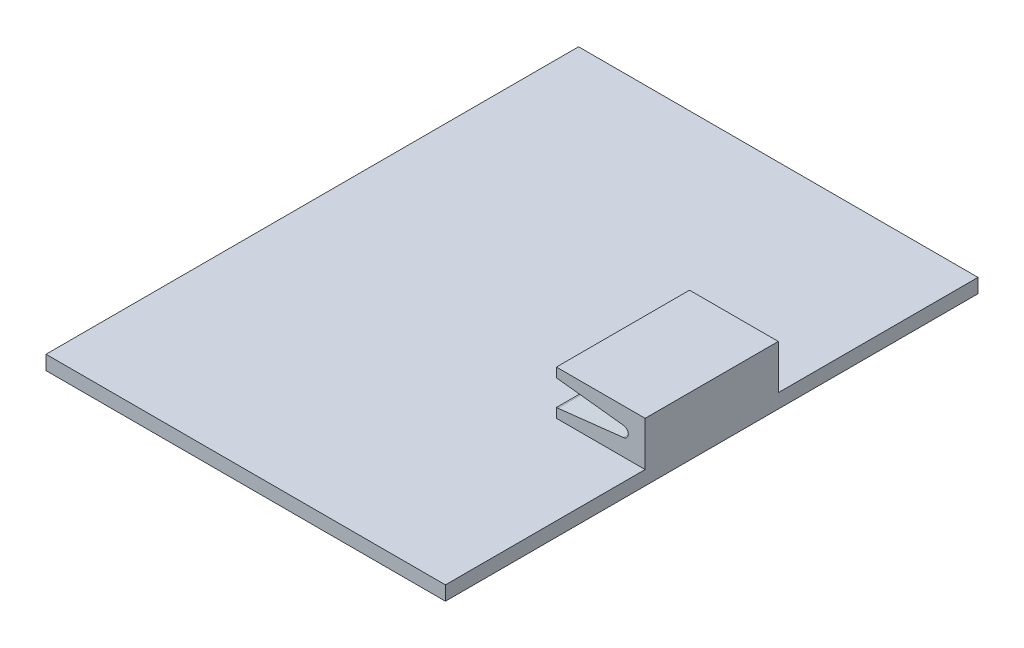
ISO-10303-21;
HEADER;
FILE_DESCRIPTION(('STEP AP214'),'2;1');
FILE_NAME('part.step','',(''),(''),'','','');
FILE_SCHEMA(('AUTOMOTIVE_DESIGN { 1 0 10303 214 1 1 1 1 }'));
ENDSEC;
DATA;
#1=APPLICATION_CONTEXT('core data for automotive mechanical design processes');
#2=APPLICATION_PROTOCOL_DEFINITION('international standard','automotive_design',2000,#1);
#3=PRODUCT_CONTEXT('',#1,'mechanical');
#4=PRODUCT('Part','Part','',(#3));
#5=PRODUCT_RELATED_PRODUCT_CATEGORY('part','',(#4));
#6=PRODUCT_DEFINITION_FORMATION('','',#4);
#7=PRODUCT_DEFINITION_CONTEXT('part definition',#1,'design');
#8=PRODUCT_DEFINITION('design','',#6,#7);
#9=PRODUCT_DEFINITION_SHAPE('','',#8);
#10=(LENGTH_UNIT() NAMED_UNIT(*) SI_UNIT(.MILLI.,.METRE.));
#11=(NAMED_UNIT(*) PLANE_ANGLE_UNIT() SI_UNIT($,.RADIAN.));
#12=(NAMED_UNIT(*) SI_UNIT($,.STERADIAN.) SOLID_ANGLE_UNIT());
#13=UNCERTAINTY_MEASURE_WITH_UNIT(LENGTH_MEASURE(1.E-05),#10,'distance_accuracy_value','');
#14=(GEOMETRIC_REPRESENTATION_CONTEXT(3) GLOBAL_UNCERTAINTY_ASSIGNED_CONTEXT((#13)) GLOBAL_UNIT_ASSIGNED_CONTEXT((#10,
#11,#12)) REPRESENTATION_CONTEXT('',''));
#15=CARTESIAN_POINT('',(0.,0.,0.));
#16=DIRECTION('',(0.,0.,1.));
#17=DIRECTION('',(1.,0.,0.));
#18=AXIS2_PLACEMENT_3D('',#15,#16,#17);
#19=CARTESIAN_POINT('',(125.,66.,-75.));
#20=DIRECTION('',(1.,0.,0.));
#21=DIRECTION('',(0.,0.,-1.));
#22=AXIS2_PLACEMENT_3D('',#19,#20,#21);
#23=PLANE('',#22);
#24=DIRECTION('',(0.,-1.,0.));
#25=VECTOR('',#24,1.);
#26=CARTESIAN_POINT('',(125.,66.,75.));
#27=LINE('',#26,#25);
#28=CARTESIAN_POINT('',(125.,26.5706899099176,75.));
#29=VERTEX_POINT('',#28);
#30=CARTESIAN_POINT('',(125.,16.,75.));
#31=VERTEX_POINT('',#30);
#32=EDGE_CURVE('E64',#29,#31,#27,.T.);
#33=ORIENTED_EDGE('',*,*,#32,.F.);
#34=DIRECTION('',(0.,0.,-1.));
#35=VECTOR('',#34,1.);
#36=CARTESIAN_POINT('',(125.,26.5706899099176,300.));
#37=LINE('',#36,#35);
#38=CARTESIAN_POINT('',(125.,26.5706899099176,-75.));
#39=VERTEX_POINT('',#38);
#40=EDGE_CURVE('E166',#29,#39,#37,.T.);
#41=ORIENTED_EDGE('',*,*,#40,.T.);
#42=DIRECTION('',(0.,-1.,0.));
#43=VECTOR('',#42,1.);
#44=CARTESIAN_POINT('',(125.,66.,-75.));
#45=LINE('',#44,#43);
#46=CARTESIAN_POINT('',(125.,16.,-75.));
#47=VERTEX_POINT('',#46);
#48=EDGE_CURVE('E164',#39,#47,#45,.T.);
#49=ORIENTED_EDGE('',*,*,#48,.T.);
#50=DIRECTION('',(0.,0.,1.));
#51=VECTOR('',#50,1.);
#52=CARTESIAN_POINT('',(125.,16.,-75.));
#53=LINE('',#52,#51);
#54=EDGE_CURVE('E194',#47,#31,#53,.T.);
#55=ORIENTED_EDGE('',*,*,#54,.T.);
#56=EDGE_LOOP('',(#33,#41,#49,#55));
#57=FACE_BOUND('',#56,.T.);
#58=ADVANCED_FACE('F39',(#57),#23,.F.);
#59=CARTESIAN_POINT('',(-225.,16.,300.));
#60=DIRECTION('',(0.,0.,-1.));
#61=DIRECTION('',(-1.,0.,0.));
#62=AXIS2_PLACEMENT_3D('',#59,#60,#61);
#63=PLANE('',#62);
#64=DIRECTION('',(1.,0.,0.));
#65=VECTOR('',#64,1.);
#66=CARTESIAN_POINT('',(-225.,0.,300.));
#67=LINE('',#66,#65);
#68=CARTESIAN_POINT('',(-225.,0.,300.));
#69=VERTEX_POINT('',#68);
#70=CARTESIAN_POINT('',(225.,0.,300.));
#71=VERTEX_POINT('',#70);
#72=EDGE_CURVE('E220',#69,#71,#67,.T.);
#73=ORIENTED_EDGE('',*,*,#72,.T.);
#74=DIRECTION('',(0.,-1.,0.));
#75=VECTOR('',#74,1.);
#76=CARTESIAN_POINT('',(225.,16.,300.));
#77=LINE('',#76,#75);
#78=CARTESIAN_POINT('',(225.,16.,300.));
#79=VERTEX_POINT('',#78);
#80=EDGE_CURVE('E250',#79,#71,#77,.T.);
#81=ORIENTED_EDGE('',*,*,#80,.F.);
#82=DIRECTION('',(1.,0.,0.));
#83=VECTOR('',#82,1.);
#84=CARTESIAN_POINT('',(-225.,16.,300.));
#85=LINE('',#84,#83);
#86=CARTESIAN_POINT('',(-225.,16.,300.));
#87=VERTEX_POINT('',#86);
#88=EDGE_CURVE('E221',#87,#79,#85,.T.);
#89=ORIENTED_EDGE('',*,*,#88,.F.);
#90=DIRECTION('',(0.,-1.,0.));
#91=VECTOR('',#90,1.);
#92=CARTESIAN_POINT('',(-225.,16.,300.));
#93=LINE('',#92,#91);
#94=EDGE_CURVE('E234',#87,#69,#93,.T.);
#95=ORIENTED_EDGE('',*,*,#94,.T.);
#96=EDGE_LOOP('',(#73,#81,#89,#95));
#97=FACE_BOUND('',#96,.T.);
#98=ADVANCED_FACE('F41',(#97),#63,.F.);
#99=CARTESIAN_POINT('',(225.,16.,300.));
#100=DIRECTION('',(-1.,0.,0.));
#101=DIRECTION('',(0.,0.,1.));
#102=AXIS2_PLACEMENT_3D('',#99,#100,#101);
#103=PLANE('',#102);
#104=DIRECTION('',(0.,0.,-1.));
#105=VECTOR('',#104,1.);
#106=CARTESIAN_POINT('',(225.,0.,300.));
#107=LINE('',#106,#105);
#108=CARTESIAN_POINT('',(225.,0.,-300.));
#109=VERTEX_POINT('',#108);
#110=EDGE_CURVE('E237',#71,#109,#107,.T.);
#111=ORIENTED_EDGE('',*,*,#110,.T.);
#112=DIRECTION('',(0.,-1.,0.));
#113=VECTOR('',#112,1.);
#114=CARTESIAN_POINT('',(225.,16.,-300.));
#115=LINE('',#114,#113);
#116=CARTESIAN_POINT('',(225.,16.,-300.));
#117=VERTEX_POINT('',#116);
#118=EDGE_CURVE('E248',#117,#109,#115,.T.);
#119=ORIENTED_EDGE('',*,*,#118,.F.);
#120=DIRECTION('',(0.,0.,-1.));
#121=VECTOR('',#120,1.);
#122=CARTESIAN_POINT('',(225.,16.,300.));
#123=LINE('',#122,#121);
#124=CARTESIAN_POINT('',(225.,16.,-75.));
#125=VERTEX_POINT('',#124);
#126=EDGE_CURVE('E224',#125,#117,#123,.T.);
#127=ORIENTED_EDGE('',*,*,#126,.F.);
#128=DIRECTION('',(0.,-1.,0.));
#129=VECTOR('',#128,1.);
#130=CARTESIAN_POINT('',(225.,66.,-75.));
#131=LINE('',#130,#129);
#132=CARTESIAN_POINT('',(225.,66.,-75.));
#133=VERTEX_POINT('',#132);
#134=EDGE_CURVE('E217',#133,#125,#131,.T.);
#135=ORIENTED_EDGE('',*,*,#134,.F.);
#136=DIRECTION('',(0.,0.,-1.));
#137=VECTOR('',#136,1.);
#138=CARTESIAN_POINT('',(225.,66.,-75.));
#139=LINE('',#138,#137);
#140=CARTESIAN_POINT('',(225.,66.,75.));
#141=VERTEX_POINT('',#140);
#142=EDGE_CURVE('E197',#141,#133,#139,.T.);
#143=ORIENTED_EDGE('',*,*,#142,.F.);
#144=DIRECTION('',(0.,-1.,0.));
#145=VECTOR('',#144,1.);
#146=CARTESIAN_POINT('',(225.,66.,75.));
#147=LINE('',#146,#145);
#148=CARTESIAN_POINT('',(225.,16.,75.));
#149=VERTEX_POINT('',#148);
#150=EDGE_CURVE('E206',#141,#149,#147,.T.);
#151=ORIENTED_EDGE('',*,*,#150,.T.);
#152=EDGE_CURVE('E226',#79,#149,#123,.T.);
#153=ORIENTED_EDGE('',*,*,#152,.F.);
#154=ORIENTED_EDGE('',*,*,#80,.T.);
#155=EDGE_LOOP('',(#111,#119,#127,#135,#143,#151,#153,#154));
#156=FACE_BOUND('',#155,.T.);
#157=ADVANCED_FACE('F276',(#156),#103,.F.);
#158=CARTESIAN_POINT('',(-225.,16.,-300.));
#159=DIRECTION('',(0.,0.,-1.));
#160=DIRECTION('',(-1.,0.,0.));
#161=AXIS2_PLACEMENT_3D('',#158,#159,#160);
#162=PLANE('',#161);
#163=DIRECTION('',(1.,0.,0.));
#164=VECTOR('',#163,1.);
#165=CARTESIAN_POINT('',(-225.,0.,-300.));
#166=LINE('',#165,#164);
#167=CARTESIAN_POINT('',(-225.,0.,-300.));
#168=VERTEX_POINT('',#167);
#169=EDGE_CURVE('E240',#168,#109,#166,.T.);
#170=ORIENTED_EDGE('',*,*,#169,.F.);
#171=DIRECTION('',(0.,-1.,0.));
#172=VECTOR('',#171,1.);
#173=CARTESIAN_POINT('',(-225.,16.,-300.));
#174=LINE('',#173,#172);
#175=CARTESIAN_POINT('',(-225.,16.,-300.));
#176=VERTEX_POINT('',#175);
#177=EDGE_CURVE('E246',#176,#168,#174,.T.);
#178=ORIENTED_EDGE('',*,*,#177,.F.);
#179=DIRECTION('',(1.,0.,0.));
#180=VECTOR('',#179,1.);
#181=CARTESIAN_POINT('',(-225.,16.,-300.));
#182=LINE('',#181,#180);
#183=EDGE_CURVE('E228',#176,#117,#182,.T.);
#184=ORIENTED_EDGE('',*,*,#183,.T.);
#185=ORIENTED_EDGE('',*,*,#118,.T.);
#186=EDGE_LOOP('',(#170,#178,#184,#185));
#187=FACE_BOUND('',#186,.T.);
#188=ADVANCED_FACE('F309',(#187),#162,.T.);
#189=CARTESIAN_POINT('',(-225.,16.,300.));
#190=DIRECTION('',(-1.,0.,0.));
#191=DIRECTION('',(0.,0.,1.));
#192=AXIS2_PLACEMENT_3D('',#189,#190,#191);
#193=PLANE('',#192);
#194=DIRECTION('',(0.,0.,-1.));
#195=VECTOR('',#194,1.);
#196=CARTESIAN_POINT('',(-225.,0.,300.));
#197=LINE('',#196,#195);
#198=EDGE_CURVE('E225',#69,#168,#197,.T.);
#199=ORIENTED_EDGE('',*,*,#198,.F.);
#200=ORIENTED_EDGE('',*,*,#94,.F.);
#201=DIRECTION('',(0.,0.,-1.));
#202=VECTOR('',#201,1.);
#203=CARTESIAN_POINT('',(-225.,16.,300.));
#204=LINE('',#203,#202);
#205=EDGE_CURVE('E231',#87,#176,#204,.T.);
#206=ORIENTED_EDGE('',*,*,#205,.T.);
#207=ORIENTED_EDGE('',*,*,#177,.T.);
#208=EDGE_LOOP('',(#199,#200,#206,#207));
#209=FACE_BOUND('',#208,.T.);
#210=ADVANCED_FACE('F306',(#209),#193,.T.);
#211=CARTESIAN_POINT('',(0.,16.,0.));
#212=DIRECTION('',(0.,1.,0.));
#213=DIRECTION('',(0.,0.,1.));
#214=AXIS2_PLACEMENT_3D('',#211,#212,#213);
#215=PLANE('',#214);
#216=DIRECTION('',(1.,0.,0.));
#217=VECTOR('',#216,1.);
#218=CARTESIAN_POINT('',(125.,16.,75.));
#219=LINE('',#218,#217);
#220=EDGE_CURVE('E201',#31,#149,#219,.T.);
#221=ORIENTED_EDGE('',*,*,#220,.F.);
#222=ORIENTED_EDGE('',*,*,#54,.F.);
#223=DIRECTION('',(-1.,0.,0.));
#224=VECTOR('',#223,1.);
#225=CARTESIAN_POINT('',(125.,16.,-75.));
#226=LINE('',#225,#224);
#227=EDGE_CURVE('E192',#125,#47,#226,.T.);
#228=ORIENTED_EDGE('',*,*,#227,.F.);
#229=ORIENTED_EDGE('',*,*,#126,.T.);
#230=ORIENTED_EDGE('',*,*,#183,.F.);
#231=ORIENTED_EDGE('',*,*,#205,.F.);
#232=ORIENTED_EDGE('',*,*,#88,.T.);
#233=ORIENTED_EDGE('',*,*,#152,.T.);
#234=EDGE_LOOP('',(#221,#222,#228,#229,#230,#231,#232,#233));
#235=FACE_BOUND('',#234,.T.);
#236=ADVANCED_FACE('F297',(#235),#215,.T.);
#237=CARTESIAN_POINT('',(0.,0.,0.));
#238=DIRECTION('',(0.,1.,0.));
#239=DIRECTION('',(0.,0.,1.));
#240=AXIS2_PLACEMENT_3D('',#237,#238,#239);
#241=PLANE('',#240);
#242=ORIENTED_EDGE('',*,*,#72,.F.);
#243=ORIENTED_EDGE('',*,*,#198,.T.);
#244=ORIENTED_EDGE('',*,*,#169,.T.);
#245=ORIENTED_EDGE('',*,*,#110,.F.);
#246=EDGE_LOOP('',(#242,#243,#244,#245));
#247=FACE_BOUND('',#246,.T.);
#248=ADVANCED_FACE('F285',(#247),#241,.F.);
#249=CARTESIAN_POINT('',(125.,66.,-75.));
#250=DIRECTION('',(0.,0.,1.));
#251=DIRECTION('',(1.,0.,0.));
#252=AXIS2_PLACEMENT_3D('',#249,#250,#251);
#253=PLANE('',#252);
#254=DIRECTION('',(-0.993664081974072,0.112390801201099,0.));
#255=VECTOR('',#254,1.);
#256=CARTESIAN_POINT('',(123.829754164358,55.6536794690466,-75.));
#257=LINE('',#256,#255);
#258=CARTESIAN_POINT('',(200.674344807207,46.9619844918445,-74.9999999999999));
#259=VERTEX_POINT('',#258);
#260=CARTESIAN_POINT('',(126.621721721803,55.337887164181,-74.9999999999999));
#261=VERTEX_POINT('',#260);
#262=EDGE_CURVE('E165',#259,#261,#257,.T.);
#263=ORIENTED_EDGE('',*,*,#262,.T.);
#264=CARTESIAN_POINT('',(125.,41.,-75.));
#265=DIRECTION('',(0.,0.,1.));
#266=DIRECTION('',(1.,0.,0.));
#267=AXIS2_PLACEMENT_3D('',#264,#265,#266);
#268=CIRCLE('',#267,14.4293100900824);
#269=CARTESIAN_POINT('',(125.,55.4293100900825,-75.));
#270=VERTEX_POINT('',#269);
#271=EDGE_CURVE('E168',#261,#270,#268,.T.);
#272=ORIENTED_EDGE('',*,*,#271,.T.);
#273=CARTESIAN_POINT('',(125.,66.,-75.));
#274=VERTEX_POINT('',#273);
#275=EDGE_CURVE('E215',#274,#270,#45,.T.);
#276=ORIENTED_EDGE('',*,*,#275,.F.);
#277=DIRECTION('',(-1.,0.,0.));
#278=VECTOR('',#277,1.);
#279=CARTESIAN_POINT('',(125.,66.,-75.));
#280=LINE('',#279,#278);
#281=EDGE_CURVE('E200',#133,#274,#280,.T.);
#282=ORIENTED_EDGE('',*,*,#281,.F.);
#283=ORIENTED_EDGE('',*,*,#134,.T.);
#284=ORIENTED_EDGE('',*,*,#227,.T.);
#285=ORIENTED_EDGE('',*,*,#48,.F.);
#286=CARTESIAN_POINT('',(126.621721721803,26.662112835819,-74.9999999999999));
#287=VERTEX_POINT('',#286);
#288=EDGE_CURVE('E155',#39,#287,#268,.T.);
#289=ORIENTED_EDGE('',*,*,#288,.T.);
#290=DIRECTION('',(0.993664081974072,0.112390801201099,0.));
#291=VECTOR('',#290,1.);
#292=CARTESIAN_POINT('',(129.413689279249,26.9779051406846,-75.));
#293=LINE('',#292,#291);
#294=CARTESIAN_POINT('',(200.674344807207,35.0380155081556,-74.9999999999999));
#295=VERTEX_POINT('',#294);
#296=EDGE_CURVE('E143',#287,#295,#293,.T.);
#297=ORIENTED_EDGE('',*,*,#296,.T.);
#298=CARTESIAN_POINT('',(200.,41.,-75.));
#299=DIRECTION('',(0.,0.,1.));
#300=DIRECTION('',(1.,0.,0.));
#301=AXIS2_PLACEMENT_3D('',#298,#299,#300);
#302=CIRCLE('',#301,6.00000000000002);
#303=EDGE_CURVE('E169',#295,#259,#302,.T.);
#304=ORIENTED_EDGE('',*,*,#303,.T.);
#305=EDGE_LOOP('',(#263,#272,#276,#282,#283,#284,#285,#289,#297,#304));
#306=FACE_BOUND('',#305,.T.);
#307=ADVANCED_FACE('F162',(#306),#253,.F.);
#308=ORIENTED_EDGE('',*,*,#275,.T.);
#309=DIRECTION('',(0.,0.,-1.));
#310=VECTOR('',#309,1.);
#311=CARTESIAN_POINT('',(125.,55.4293100900825,300.));
#312=LINE('',#311,#310);
#313=CARTESIAN_POINT('',(125.,55.4293100900825,75.));
#314=VERTEX_POINT('',#313);
#315=EDGE_CURVE('E150',#270,#314,#312,.F.);
#316=ORIENTED_EDGE('',*,*,#315,.T.);
#317=CARTESIAN_POINT('',(125.,66.,75.));
#318=VERTEX_POINT('',#317);
#319=EDGE_CURVE('E213',#318,#314,#27,.T.);
#320=ORIENTED_EDGE('',*,*,#319,.F.);
#321=DIRECTION('',(0.,0.,1.));
#322=VECTOR('',#321,1.);
#323=CARTESIAN_POINT('',(125.,66.,-75.));
#324=LINE('',#323,#322);
#325=EDGE_CURVE('E203',#274,#318,#324,.T.);
#326=ORIENTED_EDGE('',*,*,#325,.F.);
#327=EDGE_LOOP('',(#308,#316,#320,#326));
#328=FACE_BOUND('',#327,.T.);
#329=ADVANCED_FACE('F270',(#328),#23,.F.);
#330=CARTESIAN_POINT('',(125.,66.,75.));
#331=DIRECTION('',(0.,0.,-1.));
#332=DIRECTION('',(-1.,0.,0.));
#333=AXIS2_PLACEMENT_3D('',#330,#331,#332);
#334=PLANE('',#333);
#335=ORIENTED_EDGE('',*,*,#319,.T.);
#336=CARTESIAN_POINT('',(125.,41.,75.));
#337=DIRECTION('',(0.,0.,-1.));
#338=DIRECTION('',(-1.,0.,0.));
#339=AXIS2_PLACEMENT_3D('',#336,#337,#338);
#340=CIRCLE('',#339,14.4293100900824);
#341=CARTESIAN_POINT('',(126.621721721803,55.337887164181,75.0000000000001));
#342=VERTEX_POINT('',#341);
#343=EDGE_CURVE('E11',#314,#342,#340,.T.);
#344=ORIENTED_EDGE('',*,*,#343,.T.);
#345=DIRECTION('',(0.993664081974072,-0.112390801201099,0.));
#346=VECTOR('',#345,1.);
#347=CARTESIAN_POINT('',(123.829754164358,55.6536794690466,75.));
#348=LINE('',#347,#346);
#349=CARTESIAN_POINT('',(200.674344807207,46.9619844918445,75.0000000000001));
#350=VERTEX_POINT('',#349);
#351=EDGE_CURVE('E43',#342,#350,#348,.T.);
#352=ORIENTED_EDGE('',*,*,#351,.T.);
#353=CARTESIAN_POINT('',(200.,41.,75.));
#354=DIRECTION('',(0.,0.,-1.));
#355=DIRECTION('',(-1.,0.,0.));
#356=AXIS2_PLACEMENT_3D('',#353,#354,#355);
#357=CIRCLE('',#356,6.00000000000002);
#358=CARTESIAN_POINT('',(200.674344807207,35.0380155081556,75.0000000000001));
#359=VERTEX_POINT('',#358);
#360=EDGE_CURVE('E189',#350,#359,#357,.T.);
#361=ORIENTED_EDGE('',*,*,#360,.T.);
#362=DIRECTION('',(-0.993664081974072,-0.112390801201099,0.));
#363=VECTOR('',#362,1.);
#364=CARTESIAN_POINT('',(129.413689279249,26.9779051406846,75.));
#365=LINE('',#364,#363);
#366=CARTESIAN_POINT('',(126.621721721803,26.662112835819,75.));
#367=VERTEX_POINT('',#366);
#368=EDGE_CURVE('E253',#359,#367,#365,.T.);
#369=ORIENTED_EDGE('',*,*,#368,.T.);
#370=EDGE_CURVE('E49',#367,#29,#340,.T.);
#371=ORIENTED_EDGE('',*,*,#370,.T.);
#372=ORIENTED_EDGE('',*,*,#32,.T.);
#373=ORIENTED_EDGE('',*,*,#220,.T.);
#374=ORIENTED_EDGE('',*,*,#150,.F.);
#375=DIRECTION('',(1.,0.,0.));
#376=VECTOR('',#375,1.);
#377=CARTESIAN_POINT('',(125.,66.,75.));
#378=LINE('',#377,#376);
#379=EDGE_CURVE('E205',#318,#141,#378,.T.);
#380=ORIENTED_EDGE('',*,*,#379,.F.);
#381=EDGE_LOOP('',(#335,#344,#352,#361,#369,#371,#372,#373,#374,#380));
#382=FACE_BOUND('',#381,.T.);
#383=ADVANCED_FACE('F254',(#382),#334,.F.);
#384=CARTESIAN_POINT('',(0.,66.,0.));
#385=DIRECTION('',(0.,1.,0.));
#386=DIRECTION('',(0.,0.,1.));
#387=AXIS2_PLACEMENT_3D('',#384,#385,#386);
#388=PLANE('',#387);
#389=ORIENTED_EDGE('',*,*,#142,.T.);
#390=ORIENTED_EDGE('',*,*,#281,.T.);
#391=ORIENTED_EDGE('',*,*,#325,.T.);
#392=ORIENTED_EDGE('',*,*,#379,.T.);
#393=EDGE_LOOP('',(#389,#390,#391,#392));
#394=FACE_BOUND('',#393,.T.);
#395=ADVANCED_FACE('F284',(#394),#388,.T.);
#396=CARTESIAN_POINT('',(200.,41.,300.));
#397=DIRECTION('',(0.,0.,-1.));
#398=DIRECTION('',(-1.,0.,0.));
#399=AXIS2_PLACEMENT_3D('',#396,#397,#398);
#400=CYLINDRICAL_SURFACE('',#399,6.00000000000002);
#401=DIRECTION('',(0.,0.,-1.));
#402=VECTOR('',#401,1.);
#403=CARTESIAN_POINT('',(200.674344807207,35.0380155081556,300.));
#404=LINE('',#403,#402);
#405=EDGE_CURVE('E146',#359,#295,#404,.T.);
#406=ORIENTED_EDGE('',*,*,#405,.F.);
#407=ORIENTED_EDGE('',*,*,#360,.F.);
#408=DIRECTION('',(0.,0.,-1.));
#409=VECTOR('',#408,1.);
#410=CARTESIAN_POINT('',(200.674344807207,46.9619844918445,300.));
#411=LINE('',#410,#409);
#412=EDGE_CURVE('E151',#350,#259,#411,.T.);
#413=ORIENTED_EDGE('',*,*,#412,.T.);
#414=ORIENTED_EDGE('',*,*,#303,.F.);
#415=EDGE_LOOP('',(#406,#407,#413,#414));
#416=FACE_BOUND('',#415,.T.);
#417=ADVANCED_FACE('F187',(#416),#400,.F.);
#418=CARTESIAN_POINT('',(200.674344807207,46.9619844918445,300.));
#419=DIRECTION('',(0.112390801201099,0.993664081974072,0.));
#420=DIRECTION('',(-0.993664081974072,0.112390801201099,0.));
#421=AXIS2_PLACEMENT_3D('',#418,#419,#420);
#422=PLANE('',#421);
#423=ORIENTED_EDGE('',*,*,#412,.F.);
#424=ORIENTED_EDGE('',*,*,#351,.F.);
#425=DIRECTION('',(0.,0.,-1.));
#426=VECTOR('',#425,1.);
#427=CARTESIAN_POINT('',(126.621721721803,55.337887164181,300.));
#428=LINE('',#427,#426);
#429=EDGE_CURVE('E158',#342,#261,#428,.T.);
#430=ORIENTED_EDGE('',*,*,#429,.T.);
#431=ORIENTED_EDGE('',*,*,#262,.F.);
#432=EDGE_LOOP('',(#423,#424,#430,#431));
#433=FACE_BOUND('',#432,.T.);
#434=ADVANCED_FACE('F256',(#433),#422,.F.);
#435=CARTESIAN_POINT('',(125.,41.,300.));
#436=DIRECTION('',(0.,0.,-1.));
#437=DIRECTION('',(-1.,0.,0.));
#438=AXIS2_PLACEMENT_3D('',#435,#436,#437);
#439=CYLINDRICAL_SURFACE('',#438,14.4293100900824);
#440=ORIENTED_EDGE('',*,*,#40,.F.);
#441=ORIENTED_EDGE('',*,*,#370,.F.);
#442=DIRECTION('',(0.,0.,-1.));
#443=VECTOR('',#442,1.);
#444=CARTESIAN_POINT('',(126.621721721803,26.662112835819,300.));
#445=LINE('',#444,#443);
#446=EDGE_CURVE('E56',#367,#287,#445,.T.);
#447=ORIENTED_EDGE('',*,*,#446,.T.);
#448=ORIENTED_EDGE('',*,*,#288,.F.);
#449=EDGE_LOOP('',(#440,#441,#447,#448));
#450=FACE_BOUND('',#449,.T.);
#451=ADVANCED_FACE('F154',(#450),#439,.F.);
#452=ORIENTED_EDGE('',*,*,#429,.F.);
#453=ORIENTED_EDGE('',*,*,#343,.F.);
#454=ORIENTED_EDGE('',*,*,#315,.F.);
#455=ORIENTED_EDGE('',*,*,#271,.F.);
#456=EDGE_LOOP('',(#452,#453,#454,#455));
#457=FACE_BOUND('',#456,.T.);
#458=ADVANCED_FACE('F258',(#457),#439,.F.);
#459=CARTESIAN_POINT('',(200.674344807207,35.0380155081556,300.));
#460=DIRECTION('',(0.112390801201099,-0.993664081974072,0.));
#461=DIRECTION('',(0.993664081974072,0.112390801201099,0.));
#462=AXIS2_PLACEMENT_3D('',#459,#460,#461);
#463=PLANE('',#462);
#464=ORIENTED_EDGE('',*,*,#446,.F.);
#465=ORIENTED_EDGE('',*,*,#368,.F.);
#466=ORIENTED_EDGE('',*,*,#405,.T.);
#467=ORIENTED_EDGE('',*,*,#296,.F.);
#468=EDGE_LOOP('',(#464,#465,#466,#467));
#469=FACE_BOUND('',#468,.T.);
#470=ADVANCED_FACE('F144',(#469),#463,.F.);
#471=CLOSED_SHELL('',(#58,#98,#157,#188,#210,#236,#248,#307,#329,#383,#395,#417,#434,#451,#458,#470));
#472=MANIFOLD_SOLID_BREP('B2',#471);
#473=ADVANCED_BREP_SHAPE_REPRESENTATION('',(#18,#472),#14);
#474=SHAPE_DEFINITION_REPRESENTATION(#9,#473);
ENDSEC;
END-ISO-10303-21;
